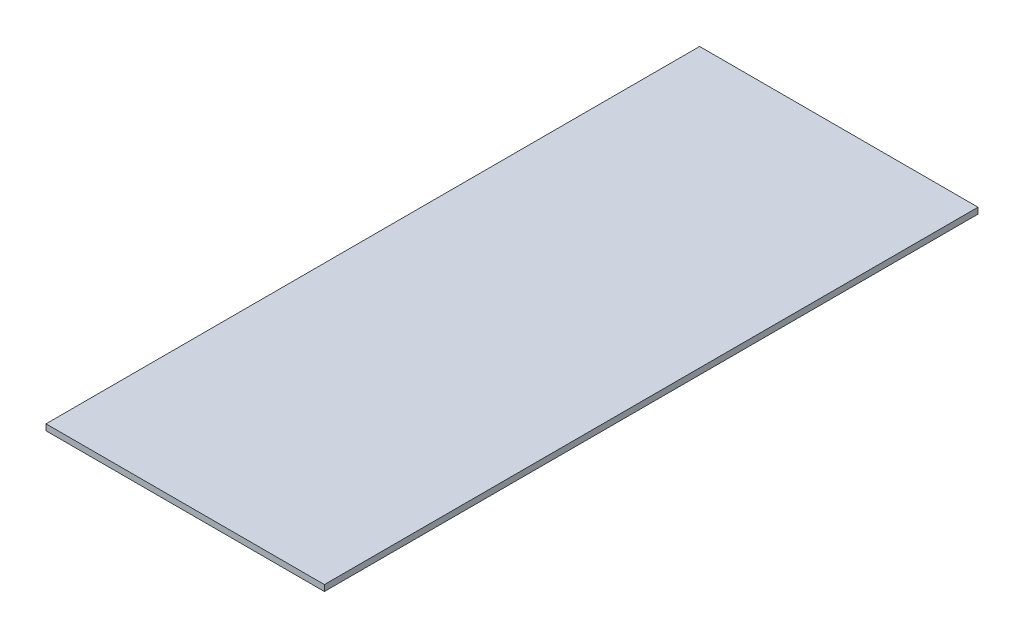
ISO-10303-21;
HEADER;
FILE_DESCRIPTION(('STEP AP214'),'2;1');
FILE_NAME('part.step','',(''),(''),'','','');
FILE_SCHEMA(('AUTOMOTIVE_DESIGN { 1 0 10303 214 1 1 1 1 }'));
ENDSEC;
DATA;
#1=APPLICATION_CONTEXT('core data for automotive mechanical design processes');
#2=APPLICATION_PROTOCOL_DEFINITION('international standard','automotive_design',2000,#1);
#3=PRODUCT_CONTEXT('',#1,'mechanical');
#4=PRODUCT('Part','Part','',(#3));
#5=PRODUCT_RELATED_PRODUCT_CATEGORY('part','',(#4));
#6=PRODUCT_DEFINITION_FORMATION('','',#4);
#7=PRODUCT_DEFINITION_CONTEXT('part definition',#1,'design');
#8=PRODUCT_DEFINITION('design','',#6,#7);
#9=PRODUCT_DEFINITION_SHAPE('','',#8);
#10=(LENGTH_UNIT() NAMED_UNIT(*) SI_UNIT(.MILLI.,.METRE.));
#11=(NAMED_UNIT(*) PLANE_ANGLE_UNIT() SI_UNIT($,.RADIAN.));
#12=(NAMED_UNIT(*) SI_UNIT($,.STERADIAN.) SOLID_ANGLE_UNIT());
#13=UNCERTAINTY_MEASURE_WITH_UNIT(LENGTH_MEASURE(1.E-05),#10,'distance_accuracy_value','');
#14=(GEOMETRIC_REPRESENTATION_CONTEXT(3) GLOBAL_UNCERTAINTY_ASSIGNED_CONTEXT((#13)) GLOBAL_UNIT_ASSIGNED_CONTEXT((#10,
#11,#12)) REPRESENTATION_CONTEXT('',''));
#15=CARTESIAN_POINT('',(0.,0.,0.));
#16=DIRECTION('',(0.,0.,1.));
#17=DIRECTION('',(1.,0.,0.));
#18=AXIS2_PLACEMENT_3D('',#15,#16,#17);
#19=CARTESIAN_POINT('',(146.05,3.175,342.9));
#20=DIRECTION('',(-1.,0.,0.));
#21=DIRECTION('',(0.,0.,1.));
#22=AXIS2_PLACEMENT_3D('',#19,#20,#21);
#23=PLANE('',#22);
#24=DIRECTION('',(0.,0.,-1.));
#25=VECTOR('',#24,1.);
#26=CARTESIAN_POINT('',(146.05,-3.175,342.9));
#27=LINE('',#26,#25);
#28=CARTESIAN_POINT('',(146.05,-3.175,342.9));
#29=VERTEX_POINT('',#28);
#30=CARTESIAN_POINT('',(146.05,-3.175,-342.9));
#31=VERTEX_POINT('',#30);
#32=EDGE_CURVE('E117',#29,#31,#27,.T.);
#33=ORIENTED_EDGE('',*,*,#32,.T.);
#34=DIRECTION('',(0.,-1.,0.));
#35=VECTOR('',#34,1.);
#36=CARTESIAN_POINT('',(146.05,3.175,-342.9));
#37=LINE('',#36,#35);
#38=CARTESIAN_POINT('',(146.05,3.175,-342.9));
#39=VERTEX_POINT('',#38);
#40=EDGE_CURVE('E11',#39,#31,#37,.T.);
#41=ORIENTED_EDGE('',*,*,#40,.F.);
#42=DIRECTION('',(0.,0.,-1.));
#43=VECTOR('',#42,1.);
#44=CARTESIAN_POINT('',(146.05,3.175,342.9));
#45=LINE('',#44,#43);
#46=CARTESIAN_POINT('',(146.05,3.175,342.9));
#47=VERTEX_POINT('',#46);
#48=EDGE_CURVE('E101',#47,#39,#45,.T.);
#49=ORIENTED_EDGE('',*,*,#48,.F.);
#50=DIRECTION('',(0.,-1.,0.));
#51=VECTOR('',#50,1.);
#52=CARTESIAN_POINT('',(146.05,3.175,342.9));
#53=LINE('',#52,#51);
#54=EDGE_CURVE('E113',#47,#29,#53,.T.);
#55=ORIENTED_EDGE('',*,*,#54,.T.);
#56=EDGE_LOOP('',(#33,#41,#49,#55));
#57=FACE_BOUND('',#56,.T.);
#58=ADVANCED_FACE('F49',(#57),#23,.F.);
#59=CARTESIAN_POINT('',(-146.05,3.175,-342.9));
#60=DIRECTION('',(0.,0.,1.));
#61=DIRECTION('',(1.,0.,0.));
#62=AXIS2_PLACEMENT_3D('',#59,#60,#61);
#63=PLANE('',#62);
#64=DIRECTION('',(-1.,0.,0.));
#65=VECTOR('',#64,1.);
#66=CARTESIAN_POINT('',(-146.05,-3.175,-342.9));
#67=LINE('',#66,#65);
#68=CARTESIAN_POINT('',(-146.05,-3.175,-342.9));
#69=VERTEX_POINT('',#68);
#70=EDGE_CURVE('E106',#31,#69,#67,.T.);
#71=ORIENTED_EDGE('',*,*,#70,.T.);
#72=DIRECTION('',(0.,-1.,0.));
#73=VECTOR('',#72,1.);
#74=CARTESIAN_POINT('',(-146.05,3.175,-342.9));
#75=LINE('',#74,#73);
#76=CARTESIAN_POINT('',(-146.05,3.175,-342.9));
#77=VERTEX_POINT('',#76);
#78=EDGE_CURVE('E58',#77,#69,#75,.T.);
#79=ORIENTED_EDGE('',*,*,#78,.F.);
#80=DIRECTION('',(-1.,0.,0.));
#81=VECTOR('',#80,1.);
#82=CARTESIAN_POINT('',(-146.05,3.175,-342.9));
#83=LINE('',#82,#81);
#84=EDGE_CURVE('E96',#39,#77,#83,.T.);
#85=ORIENTED_EDGE('',*,*,#84,.F.);
#86=ORIENTED_EDGE('',*,*,#40,.T.);
#87=EDGE_LOOP('',(#71,#79,#85,#86));
#88=FACE_BOUND('',#87,.T.);
#89=ADVANCED_FACE('F105',(#88),#63,.F.);
#90=CARTESIAN_POINT('',(-146.05,3.175,342.9));
#91=DIRECTION('',(1.,0.,0.));
#92=DIRECTION('',(0.,0.,-1.));
#93=AXIS2_PLACEMENT_3D('',#90,#91,#92);
#94=PLANE('',#93);
#95=DIRECTION('',(0.,0.,1.));
#96=VECTOR('',#95,1.);
#97=CARTESIAN_POINT('',(-146.05,-3.175,342.9));
#98=LINE('',#97,#96);
#99=CARTESIAN_POINT('',(-146.05,-3.175,342.9));
#100=VERTEX_POINT('',#99);
#101=EDGE_CURVE('E83',#69,#100,#98,.T.);
#102=ORIENTED_EDGE('',*,*,#101,.T.);
#103=DIRECTION('',(0.,-1.,0.));
#104=VECTOR('',#103,1.);
#105=CARTESIAN_POINT('',(-146.05,3.175,342.9));
#106=LINE('',#105,#104);
#107=CARTESIAN_POINT('',(-146.05,3.175,342.9));
#108=VERTEX_POINT('',#107);
#109=EDGE_CURVE('E108',#108,#100,#106,.T.);
#110=ORIENTED_EDGE('',*,*,#109,.F.);
#111=DIRECTION('',(0.,0.,1.));
#112=VECTOR('',#111,1.);
#113=CARTESIAN_POINT('',(-146.05,3.175,342.9));
#114=LINE('',#113,#112);
#115=EDGE_CURVE('E99',#77,#108,#114,.T.);
#116=ORIENTED_EDGE('',*,*,#115,.F.);
#117=ORIENTED_EDGE('',*,*,#78,.T.);
#118=EDGE_LOOP('',(#102,#110,#116,#117));
#119=FACE_BOUND('',#118,.T.);
#120=ADVANCED_FACE('F109',(#119),#94,.F.);
#121=CARTESIAN_POINT('',(-146.05,3.175,342.9));
#122=DIRECTION('',(0.,0.,-1.));
#123=DIRECTION('',(-1.,0.,0.));
#124=AXIS2_PLACEMENT_3D('',#121,#122,#123);
#125=PLANE('',#124);
#126=DIRECTION('',(1.,0.,0.));
#127=VECTOR('',#126,1.);
#128=CARTESIAN_POINT('',(-146.05,-3.175,342.9));
#129=LINE('',#128,#127);
#130=EDGE_CURVE('E89',#100,#29,#129,.T.);
#131=ORIENTED_EDGE('',*,*,#130,.T.);
#132=ORIENTED_EDGE('',*,*,#54,.F.);
#133=DIRECTION('',(1.,0.,0.));
#134=VECTOR('',#133,1.);
#135=CARTESIAN_POINT('',(-146.05,3.175,342.9));
#136=LINE('',#135,#134);
#137=EDGE_CURVE('E66',#108,#47,#136,.T.);
#138=ORIENTED_EDGE('',*,*,#137,.F.);
#139=ORIENTED_EDGE('',*,*,#109,.T.);
#140=EDGE_LOOP('',(#131,#132,#138,#139));
#141=FACE_BOUND('',#140,.T.);
#142=ADVANCED_FACE('F130',(#141),#125,.F.);
#143=CARTESIAN_POINT('',(0.,3.175,0.));
#144=DIRECTION('',(0.,-1.,0.));
#145=DIRECTION('',(0.,0.,-1.));
#146=AXIS2_PLACEMENT_3D('',#143,#144,#145);
#147=PLANE('',#146);
#148=ORIENTED_EDGE('',*,*,#48,.T.);
#149=ORIENTED_EDGE('',*,*,#84,.T.);
#150=ORIENTED_EDGE('',*,*,#115,.T.);
#151=ORIENTED_EDGE('',*,*,#137,.T.);
#152=EDGE_LOOP('',(#148,#149,#150,#151));
#153=FACE_BOUND('',#152,.T.);
#154=ADVANCED_FACE('F97',(#153),#147,.F.);
#155=CARTESIAN_POINT('',(0.,-3.175,0.));
#156=DIRECTION('',(0.,-1.,0.));
#157=DIRECTION('',(0.,0.,-1.));
#158=AXIS2_PLACEMENT_3D('',#155,#156,#157);
#159=PLANE('',#158);
#160=ORIENTED_EDGE('',*,*,#32,.F.);
#161=ORIENTED_EDGE('',*,*,#130,.F.);
#162=ORIENTED_EDGE('',*,*,#101,.F.);
#163=ORIENTED_EDGE('',*,*,#70,.F.);
#164=EDGE_LOOP('',(#160,#161,#162,#163));
#165=FACE_BOUND('',#164,.T.);
#166=ADVANCED_FACE('F133',(#165),#159,.T.);
#167=CLOSED_SHELL('',(#58,#89,#120,#142,#154,#166));
#168=MANIFOLD_SOLID_BREP('B2',#167);
#169=ADVANCED_BREP_SHAPE_REPRESENTATION('',(#18,#168),#14);
#170=SHAPE_DEFINITION_REPRESENTATION(#9,#169);
ENDSEC;
END-ISO-10303-21;
